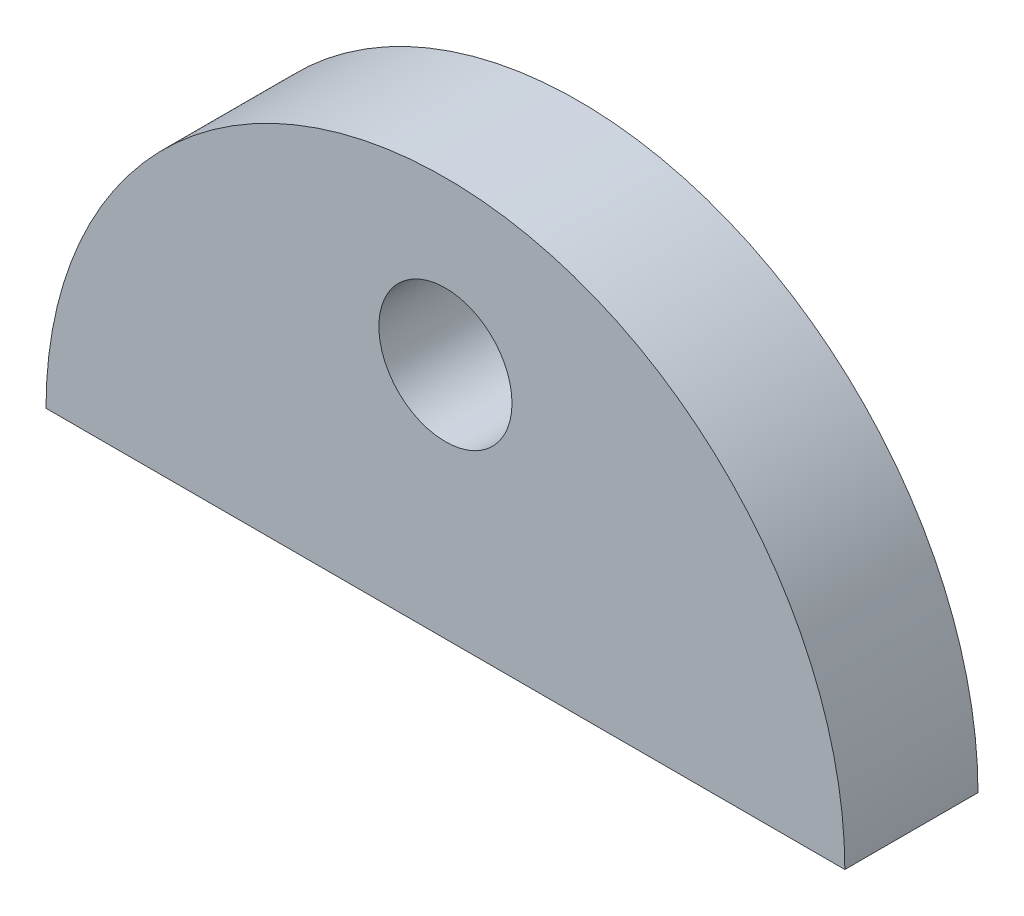
ISO-10303-21;
HEADER;
FILE_DESCRIPTION(('STEP AP214'),'2;1');
FILE_NAME('part.step','',(''),(''),'','','');
FILE_SCHEMA(('AUTOMOTIVE_DESIGN { 1 0 10303 214 1 1 1 1 }'));
ENDSEC;
DATA;
#1=APPLICATION_CONTEXT('core data for automotive mechanical design processes');
#2=APPLICATION_PROTOCOL_DEFINITION('international standard','automotive_design',2000,#1);
#3=PRODUCT_CONTEXT('',#1,'mechanical');
#4=PRODUCT('Part','Part','',(#3));
#5=PRODUCT_RELATED_PRODUCT_CATEGORY('part','',(#4));
#6=PRODUCT_DEFINITION_FORMATION('','',#4);
#7=PRODUCT_DEFINITION_CONTEXT('part definition',#1,'design');
#8=PRODUCT_DEFINITION('design','',#6,#7);
#9=PRODUCT_DEFINITION_SHAPE('','',#8);
#10=(LENGTH_UNIT() NAMED_UNIT(*) SI_UNIT(.MILLI.,.METRE.));
#11=(NAMED_UNIT(*) PLANE_ANGLE_UNIT() SI_UNIT($,.RADIAN.));
#12=(NAMED_UNIT(*) SI_UNIT($,.STERADIAN.) SOLID_ANGLE_UNIT());
#13=UNCERTAINTY_MEASURE_WITH_UNIT(LENGTH_MEASURE(1.E-05),#10,'distance_accuracy_value','');
#14=(GEOMETRIC_REPRESENTATION_CONTEXT(3) GLOBAL_UNCERTAINTY_ASSIGNED_CONTEXT((#13)) GLOBAL_UNIT_ASSIGNED_CONTEXT((#10,
#11,#12)) REPRESENTATION_CONTEXT('',''));
#15=CARTESIAN_POINT('',(0.,0.,0.));
#16=DIRECTION('',(0.,0.,1.));
#17=DIRECTION('',(1.,0.,0.));
#18=AXIS2_PLACEMENT_3D('',#15,#16,#17);
#19=CARTESIAN_POINT('',(-19.05,-7.97372362550423,9.55675));
#20=DIRECTION('',(0.,0.,-1.));
#21=DIRECTION('',(-1.,0.,0.));
#22=AXIS2_PLACEMENT_3D('',#19,#20,#21);
#23=PLANE('',#22);
#24=CARTESIAN_POINT('',(-19.05,-7.97372362550423,9.55675));
#25=DIRECTION('',(0.,0.,1.));
#26=DIRECTION('',(-1.,0.,0.));
#27=AXIS2_PLACEMENT_3D('',#24,#25,#26);
#28=CIRCLE('',#27,38.2905);
#29=CARTESIAN_POINT('',(19.2405,-7.97372362550422,9.55675));
#30=VERTEX_POINT('',#29);
#31=CARTESIAN_POINT('',(-57.3405,-7.97372362550422,9.55675));
#32=VERTEX_POINT('',#31);
#33=EDGE_CURVE('E66',#30,#32,#28,.T.);
#34=ORIENTED_EDGE('',*,*,#33,.T.);
#35=DIRECTION('',(1.,0.,0.));
#36=VECTOR('',#35,1.);
#37=CARTESIAN_POINT('',(-57.3405,-7.97372362550422,9.55675));
#38=LINE('',#37,#36);
#39=EDGE_CURVE('E51',#32,#30,#38,.T.);
#40=ORIENTED_EDGE('',*,*,#39,.T.);
#41=EDGE_LOOP('',(#34,#40));
#42=FACE_BOUND('',#41,.T.);
#43=CARTESIAN_POINT('',(-19.05,14.7796577308046,9.55675));
#44=DIRECTION('',(0.,0.,1.));
#45=DIRECTION('',(1.,0.,0.));
#46=AXIS2_PLACEMENT_3D('',#43,#44,#45);
#47=CIRCLE('',#46,6.38175);
#48=CARTESIAN_POINT('',(-12.66825,14.7796577308046,9.55675));
#49=VERTEX_POINT('',#48);
#50=EDGE_CURVE('E72',#49,#49,#47,.T.);
#51=ORIENTED_EDGE('',*,*,#50,.F.);
#52=EDGE_LOOP('',(#51));
#53=FACE_BOUND('',#52,.T.);
#54=ADVANCED_FACE('F35',(#42,#53),#23,.F.);
#55=CARTESIAN_POINT('',(-19.05,-7.97372362550423,-3.20675));
#56=DIRECTION('',(0.,0.,-1.));
#57=DIRECTION('',(-1.,0.,0.));
#58=AXIS2_PLACEMENT_3D('',#55,#56,#57);
#59=PLANE('',#58);
#60=CARTESIAN_POINT('',(-19.05,-7.97372362550423,-3.20675));
#61=DIRECTION('',(0.,0.,1.));
#62=DIRECTION('',(-1.,0.,0.));
#63=AXIS2_PLACEMENT_3D('',#60,#61,#62);
#64=CIRCLE('',#63,38.2905);
#65=CARTESIAN_POINT('',(19.2405,-7.97372362550422,-3.20675));
#66=VERTEX_POINT('',#65);
#67=CARTESIAN_POINT('',(-57.3405,-7.97372362550422,-3.20675));
#68=VERTEX_POINT('',#67);
#69=EDGE_CURVE('E67',#66,#68,#64,.T.);
#70=ORIENTED_EDGE('',*,*,#69,.F.);
#71=DIRECTION('',(1.,0.,0.));
#72=VECTOR('',#71,1.);
#73=CARTESIAN_POINT('',(-57.3405,-7.97372362550422,-3.20675));
#74=LINE('',#73,#72);
#75=EDGE_CURVE('E59',#68,#66,#74,.T.);
#76=ORIENTED_EDGE('',*,*,#75,.F.);
#77=EDGE_LOOP('',(#70,#76));
#78=FACE_BOUND('',#77,.T.);
#79=CARTESIAN_POINT('',(-19.05,14.7796577308046,-3.20675));
#80=DIRECTION('',(0.,0.,1.));
#81=DIRECTION('',(1.,0.,0.));
#82=AXIS2_PLACEMENT_3D('',#79,#80,#81);
#83=CIRCLE('',#82,6.38175);
#84=CARTESIAN_POINT('',(-12.66825,14.7796577308046,-3.20675));
#85=VERTEX_POINT('',#84);
#86=EDGE_CURVE('E75',#85,#85,#83,.T.);
#87=ORIENTED_EDGE('',*,*,#86,.T.);
#88=EDGE_LOOP('',(#87));
#89=FACE_BOUND('',#88,.T.);
#90=ADVANCED_FACE('F70',(#78,#89),#59,.T.);
#91=CARTESIAN_POINT('',(-19.05,-7.97372362550423,9.55675));
#92=DIRECTION('',(0.,0.,-1.));
#93=DIRECTION('',(-1.,0.,0.));
#94=AXIS2_PLACEMENT_3D('',#91,#92,#93);
#95=CYLINDRICAL_SURFACE('',#94,38.2905);
#96=ORIENTED_EDGE('',*,*,#69,.T.);
#97=DIRECTION('',(0.,0.,-1.));
#98=VECTOR('',#97,1.);
#99=CARTESIAN_POINT('',(-57.3405,-7.97372362550422,9.55675));
#100=LINE('',#99,#98);
#101=EDGE_CURVE('E11',#32,#68,#100,.T.);
#102=ORIENTED_EDGE('',*,*,#101,.F.);
#103=ORIENTED_EDGE('',*,*,#33,.F.);
#104=DIRECTION('',(0.,0.,-1.));
#105=VECTOR('',#104,1.);
#106=CARTESIAN_POINT('',(19.2405,-7.97372362550422,9.55675));
#107=LINE('',#106,#105);
#108=EDGE_CURVE('E44',#30,#66,#107,.T.);
#109=ORIENTED_EDGE('',*,*,#108,.T.);
#110=EDGE_LOOP('',(#96,#102,#103,#109));
#111=FACE_BOUND('',#110,.T.);
#112=ADVANCED_FACE('F37',(#111),#95,.T.);
#113=CARTESIAN_POINT('',(-57.3405,-7.97372362550422,9.55675));
#114=DIRECTION('',(0.,1.,0.));
#115=DIRECTION('',(0.,0.,1.));
#116=AXIS2_PLACEMENT_3D('',#113,#114,#115);
#117=PLANE('',#116);
#118=ORIENTED_EDGE('',*,*,#75,.T.);
#119=ORIENTED_EDGE('',*,*,#108,.F.);
#120=ORIENTED_EDGE('',*,*,#39,.F.);
#121=ORIENTED_EDGE('',*,*,#101,.T.);
#122=EDGE_LOOP('',(#118,#119,#120,#121));
#123=FACE_BOUND('',#122,.T.);
#124=ADVANCED_FACE('F62',(#123),#117,.F.);
#125=CARTESIAN_POINT('',(-19.05,14.7796577308046,9.55675));
#126=DIRECTION('',(0.,0.,-1.));
#127=DIRECTION('',(-1.,0.,0.));
#128=AXIS2_PLACEMENT_3D('',#125,#126,#127);
#129=CYLINDRICAL_SURFACE('',#128,6.38175);
#130=ORIENTED_EDGE('',*,*,#50,.T.);
#131=EDGE_LOOP('',(#130));
#132=FACE_BOUND('',#131,.T.);
#133=ORIENTED_EDGE('',*,*,#86,.F.);
#134=EDGE_LOOP('',(#133));
#135=FACE_BOUND('',#134,.T.);
#136=ADVANCED_FACE('F83',(#132,#135),#129,.F.);
#137=CLOSED_SHELL('',(#54,#90,#112,#124,#136));
#138=MANIFOLD_SOLID_BREP('B2',#137);
#139=ADVANCED_BREP_SHAPE_REPRESENTATION('',(#18,#138),#14);
#140=SHAPE_DEFINITION_REPRESENTATION(#9,#139);
ENDSEC;
END-ISO-10303-21;
